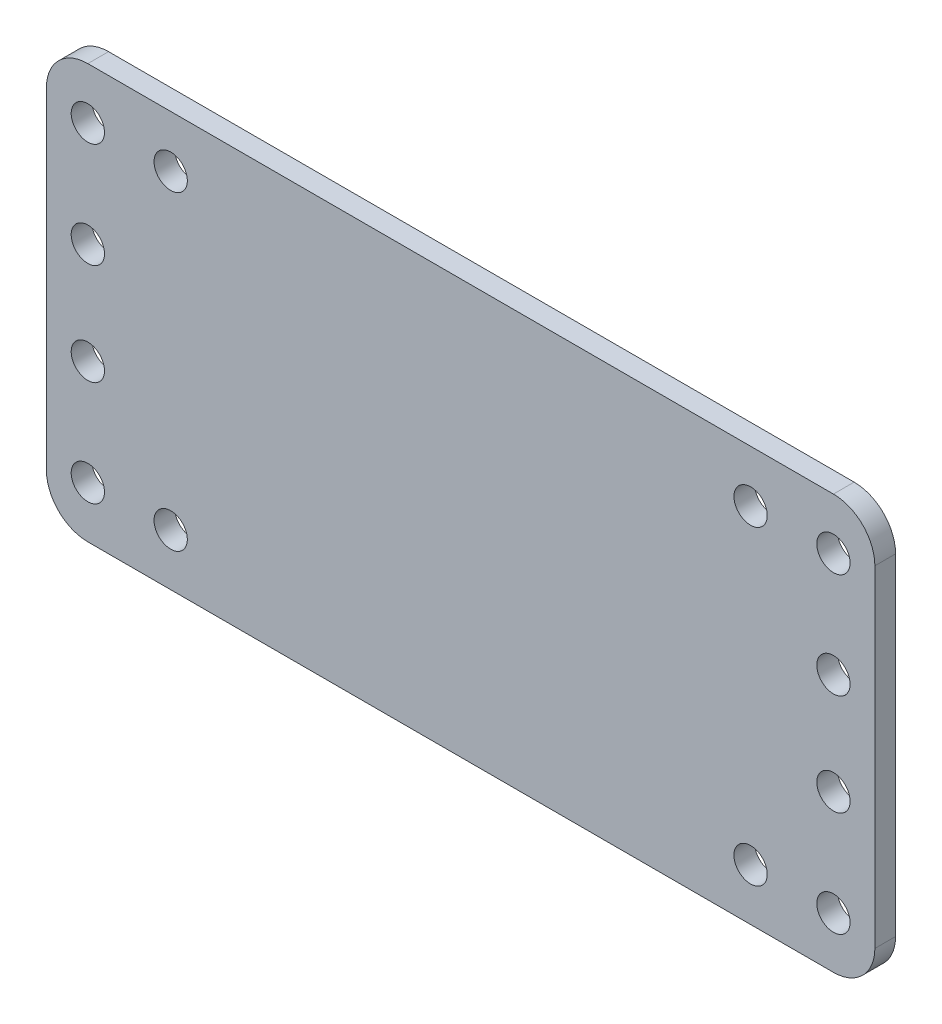
ISO-10303-21;
HEADER;
FILE_DESCRIPTION(('STEP AP214'),'2;1');
FILE_NAME('part.step','',(''),(''),'','','');
FILE_SCHEMA(('AUTOMOTIVE_DESIGN { 1 0 10303 214 1 1 1 1 }'));
ENDSEC;
DATA;
#1=APPLICATION_CONTEXT('core data for automotive mechanical design processes');
#2=APPLICATION_PROTOCOL_DEFINITION('international standard','automotive_design',2000,#1);
#3=PRODUCT_CONTEXT('',#1,'mechanical');
#4=PRODUCT('Part','Part','',(#3));
#5=PRODUCT_RELATED_PRODUCT_CATEGORY('part','',(#4));
#6=PRODUCT_DEFINITION_FORMATION('','',#4);
#7=PRODUCT_DEFINITION_CONTEXT('part definition',#1,'design');
#8=PRODUCT_DEFINITION('design','',#6,#7);
#9=PRODUCT_DEFINITION_SHAPE('','',#8);
#10=(LENGTH_UNIT() NAMED_UNIT(*) SI_UNIT(.MILLI.,.METRE.));
#11=(NAMED_UNIT(*) PLANE_ANGLE_UNIT() SI_UNIT($,.RADIAN.));
#12=(NAMED_UNIT(*) SI_UNIT($,.STERADIAN.) SOLID_ANGLE_UNIT());
#13=UNCERTAINTY_MEASURE_WITH_UNIT(LENGTH_MEASURE(1.E-05),#10,'distance_accuracy_value','');
#14=(GEOMETRIC_REPRESENTATION_CONTEXT(3) GLOBAL_UNCERTAINTY_ASSIGNED_CONTEXT((#13)) GLOBAL_UNIT_ASSIGNED_CONTEXT((#10,
#11,#12)) REPRESENTATION_CONTEXT('',''));
#15=CARTESIAN_POINT('',(0.,0.,0.));
#16=DIRECTION('',(0.,0.,1.));
#17=DIRECTION('',(1.,0.,0.));
#18=AXIS2_PLACEMENT_3D('',#15,#16,#17);
#19=CARTESIAN_POINT('',(0.,0.,-1.5875));
#20=DIRECTION('',(0.,0.,-1.));
#21=DIRECTION('',(-1.,0.,0.));
#22=AXIS2_PLACEMENT_3D('',#19,#20,#21);
#23=PLANE('',#22);
#24=DIRECTION('',(0.,1.,0.));
#25=VECTOR('',#24,1.);
#26=CARTESIAN_POINT('',(-63.5,-31.75,-1.5875));
#27=LINE('',#26,#25);
#28=CARTESIAN_POINT('',(-63.5,-25.4,-1.5875));
#29=VERTEX_POINT('',#28);
#30=CARTESIAN_POINT('',(-63.5,25.4,-1.5875));
#31=VERTEX_POINT('',#30);
#32=EDGE_CURVE('E78',#29,#31,#27,.T.);
#33=ORIENTED_EDGE('',*,*,#32,.T.);
#34=CARTESIAN_POINT('',(-57.15,25.4,-1.5875));
#35=DIRECTION('',(0.,0.,-1.));
#36=DIRECTION('',(-1.,0.,0.));
#37=AXIS2_PLACEMENT_3D('',#34,#35,#36);
#38=CIRCLE('',#37,6.35);
#39=CARTESIAN_POINT('',(-57.15,31.75,-1.5875));
#40=VERTEX_POINT('',#39);
#41=EDGE_CURVE('E169',#40,#31,#38,.F.);
#42=ORIENTED_EDGE('',*,*,#41,.F.);
#43=DIRECTION('',(1.,0.,0.));
#44=VECTOR('',#43,1.);
#45=CARTESIAN_POINT('',(-63.5,31.75,-1.5875));
#46=LINE('',#45,#44);
#47=CARTESIAN_POINT('',(57.15,31.75,-1.5875));
#48=VERTEX_POINT('',#47);
#49=EDGE_CURVE('E114',#40,#48,#46,.T.);
#50=ORIENTED_EDGE('',*,*,#49,.T.);
#51=CARTESIAN_POINT('',(57.15,25.4,-1.5875));
#52=DIRECTION('',(0.,0.,-1.));
#53=DIRECTION('',(-1.,0.,0.));
#54=AXIS2_PLACEMENT_3D('',#51,#52,#53);
#55=CIRCLE('',#54,6.35);
#56=CARTESIAN_POINT('',(63.5,25.4,-1.5875));
#57=VERTEX_POINT('',#56);
#58=EDGE_CURVE('E116',#57,#48,#55,.F.);
#59=ORIENTED_EDGE('',*,*,#58,.F.);
#60=DIRECTION('',(0.,1.,0.));
#61=VECTOR('',#60,1.);
#62=CARTESIAN_POINT('',(63.5,-31.75,-1.5875));
#63=LINE('',#62,#61);
#64=CARTESIAN_POINT('',(63.4999999999999,-25.4,-1.5875));
#65=VERTEX_POINT('',#64);
#66=EDGE_CURVE('E111',#57,#65,#63,.F.);
#67=ORIENTED_EDGE('',*,*,#66,.T.);
#68=CARTESIAN_POINT('',(57.1499999999999,-25.4,-1.5875));
#69=DIRECTION('',(0.,0.,-1.));
#70=DIRECTION('',(-1.,0.,0.));
#71=AXIS2_PLACEMENT_3D('',#68,#69,#70);
#72=CIRCLE('',#71,6.35);
#73=CARTESIAN_POINT('',(57.15,-31.75,-1.5875));
#74=VERTEX_POINT('',#73);
#75=EDGE_CURVE('E97',#74,#65,#72,.F.);
#76=ORIENTED_EDGE('',*,*,#75,.F.);
#77=DIRECTION('',(1.,0.,0.));
#78=VECTOR('',#77,1.);
#79=CARTESIAN_POINT('',(-63.5,-31.75,-1.5875));
#80=LINE('',#79,#78);
#81=CARTESIAN_POINT('',(-57.15,-31.75,-1.5875));
#82=VERTEX_POINT('',#81);
#83=EDGE_CURVE('E92',#74,#82,#80,.F.);
#84=ORIENTED_EDGE('',*,*,#83,.T.);
#85=CARTESIAN_POINT('',(-57.15,-25.4,-1.5875));
#86=DIRECTION('',(0.,0.,-1.));
#87=DIRECTION('',(-1.,0.,0.));
#88=AXIS2_PLACEMENT_3D('',#85,#86,#87);
#89=CIRCLE('',#88,6.35);
#90=EDGE_CURVE('E83',#29,#82,#89,.F.);
#91=ORIENTED_EDGE('',*,*,#90,.F.);
#92=EDGE_LOOP('',(#33,#42,#50,#59,#67,#76,#84,#91));
#93=FACE_BOUND('',#92,.T.);
#94=CARTESIAN_POINT('',(-44.45,23.8125,-1.5875));
#95=DIRECTION('',(0.,0.,1.));
#96=DIRECTION('',(1.,0.,0.));
#97=AXIS2_PLACEMENT_3D('',#94,#95,#96);
#98=CIRCLE('',#97,2.5527);
#99=CARTESIAN_POINT('',(-41.8973,23.8125,-1.5875));
#100=VERTEX_POINT('',#99);
#101=EDGE_CURVE('E101',#100,#100,#98,.T.);
#102=ORIENTED_EDGE('',*,*,#101,.T.);
#103=EDGE_LOOP('',(#102));
#104=FACE_BOUND('',#103,.T.);
#105=CARTESIAN_POINT('',(-57.15,7.76883262356666,-1.5875));
#106=DIRECTION('',(0.,0.,1.));
#107=DIRECTION('',(1.,0.,0.));
#108=AXIS2_PLACEMENT_3D('',#105,#106,#107);
#109=CIRCLE('',#108,2.5527);
#110=CARTESIAN_POINT('',(-54.5973,7.76883262356666,-1.5875));
#111=VERTEX_POINT('',#110);
#112=EDGE_CURVE('E174',#111,#111,#109,.T.);
#113=ORIENTED_EDGE('',*,*,#112,.T.);
#114=EDGE_LOOP('',(#113));
#115=FACE_BOUND('',#114,.T.);
#116=CARTESIAN_POINT('',(-57.15,-7.76883262356668,-1.5875));
#117=DIRECTION('',(0.,0.,1.));
#118=DIRECTION('',(1.,0.,0.));
#119=AXIS2_PLACEMENT_3D('',#116,#117,#118);
#120=CIRCLE('',#119,2.5527);
#121=CARTESIAN_POINT('',(-54.5973,-7.76883262356668,-1.5875));
#122=VERTEX_POINT('',#121);
#123=EDGE_CURVE('E177',#122,#122,#120,.T.);
#124=ORIENTED_EDGE('',*,*,#123,.T.);
#125=EDGE_LOOP('',(#124));
#126=FACE_BOUND('',#125,.T.);
#127=CARTESIAN_POINT('',(-57.15,-23.8727552516291,-1.5875));
#128=DIRECTION('',(0.,0.,1.));
#129=DIRECTION('',(1.,0.,0.));
#130=AXIS2_PLACEMENT_3D('',#127,#128,#129);
#131=CIRCLE('',#130,2.5527);
#132=CARTESIAN_POINT('',(-54.5973,-23.8727552516291,-1.5875));
#133=VERTEX_POINT('',#132);
#134=EDGE_CURVE('E180',#133,#133,#131,.T.);
#135=ORIENTED_EDGE('',*,*,#134,.T.);
#136=EDGE_LOOP('',(#135));
#137=FACE_BOUND('',#136,.T.);
#138=CARTESIAN_POINT('',(-44.45,-23.8125,-1.5875));
#139=DIRECTION('',(0.,0.,1.));
#140=DIRECTION('',(1.,0.,0.));
#141=AXIS2_PLACEMENT_3D('',#138,#139,#140);
#142=CIRCLE('',#141,2.5527);
#143=CARTESIAN_POINT('',(-41.8973,-23.8125,-1.5875));
#144=VERTEX_POINT('',#143);
#145=EDGE_CURVE('E183',#144,#144,#142,.T.);
#146=ORIENTED_EDGE('',*,*,#145,.T.);
#147=EDGE_LOOP('',(#146));
#148=FACE_BOUND('',#147,.T.);
#149=CARTESIAN_POINT('',(44.45,-23.8125,-1.5875));
#150=DIRECTION('',(0.,0.,1.));
#151=DIRECTION('',(1.,0.,0.));
#152=AXIS2_PLACEMENT_3D('',#149,#150,#151);
#153=CIRCLE('',#152,2.5527);
#154=CARTESIAN_POINT('',(47.0027,-23.8125,-1.5875));
#155=VERTEX_POINT('',#154);
#156=EDGE_CURVE('E186',#155,#155,#153,.T.);
#157=ORIENTED_EDGE('',*,*,#156,.T.);
#158=EDGE_LOOP('',(#157));
#159=FACE_BOUND('',#158,.T.);
#160=CARTESIAN_POINT('',(57.15,-23.8727552516291,-1.5875));
#161=DIRECTION('',(0.,0.,1.));
#162=DIRECTION('',(1.,0.,0.));
#163=AXIS2_PLACEMENT_3D('',#160,#161,#162);
#164=CIRCLE('',#163,2.5527);
#165=CARTESIAN_POINT('',(59.7027,-23.8727552516291,-1.5875));
#166=VERTEX_POINT('',#165);
#167=EDGE_CURVE('E189',#166,#166,#164,.T.);
#168=ORIENTED_EDGE('',*,*,#167,.T.);
#169=EDGE_LOOP('',(#168));
#170=FACE_BOUND('',#169,.T.);
#171=CARTESIAN_POINT('',(57.15,-7.76883262356667,-1.5875));
#172=DIRECTION('',(0.,0.,1.));
#173=DIRECTION('',(1.,0.,0.));
#174=AXIS2_PLACEMENT_3D('',#171,#172,#173);
#175=CIRCLE('',#174,2.5527);
#176=CARTESIAN_POINT('',(59.7027,-7.76883262356667,-1.5875));
#177=VERTEX_POINT('',#176);
#178=EDGE_CURVE('E192',#177,#177,#175,.T.);
#179=ORIENTED_EDGE('',*,*,#178,.T.);
#180=EDGE_LOOP('',(#179));
#181=FACE_BOUND('',#180,.T.);
#182=CARTESIAN_POINT('',(57.15,7.76883262356667,-1.5875));
#183=DIRECTION('',(0.,0.,1.));
#184=DIRECTION('',(1.,0.,0.));
#185=AXIS2_PLACEMENT_3D('',#182,#183,#184);
#186=CIRCLE('',#185,2.5527);
#187=CARTESIAN_POINT('',(59.7027,7.76883262356667,-1.5875));
#188=VERTEX_POINT('',#187);
#189=EDGE_CURVE('E195',#188,#188,#186,.T.);
#190=ORIENTED_EDGE('',*,*,#189,.T.);
#191=EDGE_LOOP('',(#190));
#192=FACE_BOUND('',#191,.T.);
#193=CARTESIAN_POINT('',(57.15,23.8727552516291,-1.5875));
#194=DIRECTION('',(0.,0.,1.));
#195=DIRECTION('',(1.,0.,0.));
#196=AXIS2_PLACEMENT_3D('',#193,#194,#195);
#197=CIRCLE('',#196,2.5527);
#198=CARTESIAN_POINT('',(59.7027,23.8727552516291,-1.5875));
#199=VERTEX_POINT('',#198);
#200=EDGE_CURVE('E198',#199,#199,#197,.T.);
#201=ORIENTED_EDGE('',*,*,#200,.T.);
#202=EDGE_LOOP('',(#201));
#203=FACE_BOUND('',#202,.T.);
#204=CARTESIAN_POINT('',(44.45,23.8125,-1.5875));
#205=DIRECTION('',(0.,0.,1.));
#206=DIRECTION('',(1.,0.,0.));
#207=AXIS2_PLACEMENT_3D('',#204,#205,#206);
#208=CIRCLE('',#207,2.5527);
#209=CARTESIAN_POINT('',(47.0027,23.8125,-1.5875));
#210=VERTEX_POINT('',#209);
#211=EDGE_CURVE('E200',#210,#210,#208,.T.);
#212=ORIENTED_EDGE('',*,*,#211,.T.);
#213=EDGE_LOOP('',(#212));
#214=FACE_BOUND('',#213,.T.);
#215=CARTESIAN_POINT('',(-57.15,23.8727552516291,-1.5875));
#216=DIRECTION('',(0.,0.,1.));
#217=DIRECTION('',(1.,0.,0.));
#218=AXIS2_PLACEMENT_3D('',#215,#216,#217);
#219=CIRCLE('',#218,2.5527);
#220=CARTESIAN_POINT('',(-54.5973,23.8727552516291,-1.5875));
#221=VERTEX_POINT('',#220);
#222=EDGE_CURVE('E20',#221,#221,#219,.T.);
#223=ORIENTED_EDGE('',*,*,#222,.T.);
#224=EDGE_LOOP('',(#223));
#225=FACE_BOUND('',#224,.T.);
#226=ADVANCED_FACE('F17',(#93,#104,#115,#126,#137,#148,#159,#170,#181,#192,#203,#214,#225),#23,.T.);
#227=CARTESIAN_POINT('',(-57.15,23.8727552516291,-1.5875));
#228=DIRECTION('',(0.,0.,1.));
#229=DIRECTION('',(1.,0.,0.));
#230=AXIS2_PLACEMENT_3D('',#227,#228,#229);
#231=CYLINDRICAL_SURFACE('',#230,2.5527);
#232=ORIENTED_EDGE('',*,*,#222,.F.);
#233=EDGE_LOOP('',(#232));
#234=FACE_BOUND('',#233,.T.);
#235=CARTESIAN_POINT('',(-57.15,23.8727552516291,1.5875));
#236=DIRECTION('',(0.,0.,1.));
#237=DIRECTION('',(1.,0.,0.));
#238=AXIS2_PLACEMENT_3D('',#235,#236,#237);
#239=CIRCLE('',#238,2.5527);
#240=CARTESIAN_POINT('',(-54.5973,23.8727552516291,1.5875));
#241=VERTEX_POINT('',#240);
#242=EDGE_CURVE('E162',#241,#241,#239,.T.);
#243=ORIENTED_EDGE('',*,*,#242,.T.);
#244=EDGE_LOOP('',(#243));
#245=FACE_BOUND('',#244,.T.);
#246=ADVANCED_FACE('F208',(#234,#245),#231,.F.);
#247=CARTESIAN_POINT('',(44.45,23.8125,-1.5875));
#248=DIRECTION('',(0.,0.,1.));
#249=DIRECTION('',(1.,0.,0.));
#250=AXIS2_PLACEMENT_3D('',#247,#248,#249);
#251=CYLINDRICAL_SURFACE('',#250,2.5527);
#252=ORIENTED_EDGE('',*,*,#211,.F.);
#253=EDGE_LOOP('',(#252));
#254=FACE_BOUND('',#253,.T.);
#255=CARTESIAN_POINT('',(44.45,23.8125,1.5875));
#256=DIRECTION('',(0.,0.,1.));
#257=DIRECTION('',(1.,0.,0.));
#258=AXIS2_PLACEMENT_3D('',#255,#256,#257);
#259=CIRCLE('',#258,2.5527);
#260=CARTESIAN_POINT('',(47.0027,23.8125,1.5875));
#261=VERTEX_POINT('',#260);
#262=EDGE_CURVE('E159',#261,#261,#259,.T.);
#263=ORIENTED_EDGE('',*,*,#262,.T.);
#264=EDGE_LOOP('',(#263));
#265=FACE_BOUND('',#264,.T.);
#266=ADVANCED_FACE('F211',(#254,#265),#251,.F.);
#267=CARTESIAN_POINT('',(57.15,23.8727552516291,-1.5875));
#268=DIRECTION('',(0.,0.,1.));
#269=DIRECTION('',(1.,0.,0.));
#270=AXIS2_PLACEMENT_3D('',#267,#268,#269);
#271=CYLINDRICAL_SURFACE('',#270,2.5527);
#272=ORIENTED_EDGE('',*,*,#200,.F.);
#273=EDGE_LOOP('',(#272));
#274=FACE_BOUND('',#273,.T.);
#275=CARTESIAN_POINT('',(57.15,23.8727552516291,1.5875));
#276=DIRECTION('',(0.,0.,1.));
#277=DIRECTION('',(1.,0.,0.));
#278=AXIS2_PLACEMENT_3D('',#275,#276,#277);
#279=CIRCLE('',#278,2.5527);
#280=CARTESIAN_POINT('',(59.7027,23.8727552516291,1.5875));
#281=VERTEX_POINT('',#280);
#282=EDGE_CURVE('E156',#281,#281,#279,.T.);
#283=ORIENTED_EDGE('',*,*,#282,.T.);
#284=EDGE_LOOP('',(#283));
#285=FACE_BOUND('',#284,.T.);
#286=ADVANCED_FACE('F285',(#274,#285),#271,.F.);
#287=CARTESIAN_POINT('',(57.15,7.76883262356667,-1.5875));
#288=DIRECTION('',(0.,0.,1.));
#289=DIRECTION('',(1.,0.,0.));
#290=AXIS2_PLACEMENT_3D('',#287,#288,#289);
#291=CYLINDRICAL_SURFACE('',#290,2.5527);
#292=ORIENTED_EDGE('',*,*,#189,.F.);
#293=EDGE_LOOP('',(#292));
#294=FACE_BOUND('',#293,.T.);
#295=CARTESIAN_POINT('',(57.15,7.76883262356667,1.5875));
#296=DIRECTION('',(0.,0.,1.));
#297=DIRECTION('',(1.,0.,0.));
#298=AXIS2_PLACEMENT_3D('',#295,#296,#297);
#299=CIRCLE('',#298,2.5527);
#300=CARTESIAN_POINT('',(59.7027,7.76883262356667,1.5875));
#301=VERTEX_POINT('',#300);
#302=EDGE_CURVE('E153',#301,#301,#299,.T.);
#303=ORIENTED_EDGE('',*,*,#302,.T.);
#304=EDGE_LOOP('',(#303));
#305=FACE_BOUND('',#304,.T.);
#306=ADVANCED_FACE('F281',(#294,#305),#291,.F.);
#307=CARTESIAN_POINT('',(57.15,-7.76883262356667,-1.5875));
#308=DIRECTION('',(0.,0.,1.));
#309=DIRECTION('',(1.,0.,0.));
#310=AXIS2_PLACEMENT_3D('',#307,#308,#309);
#311=CYLINDRICAL_SURFACE('',#310,2.5527);
#312=ORIENTED_EDGE('',*,*,#178,.F.);
#313=EDGE_LOOP('',(#312));
#314=FACE_BOUND('',#313,.T.);
#315=CARTESIAN_POINT('',(57.15,-7.76883262356667,1.5875));
#316=DIRECTION('',(0.,0.,1.));
#317=DIRECTION('',(1.,0.,0.));
#318=AXIS2_PLACEMENT_3D('',#315,#316,#317);
#319=CIRCLE('',#318,2.5527);
#320=CARTESIAN_POINT('',(59.7027,-7.76883262356667,1.5875));
#321=VERTEX_POINT('',#320);
#322=EDGE_CURVE('E150',#321,#321,#319,.T.);
#323=ORIENTED_EDGE('',*,*,#322,.T.);
#324=EDGE_LOOP('',(#323));
#325=FACE_BOUND('',#324,.T.);
#326=ADVANCED_FACE('F277',(#314,#325),#311,.F.);
#327=CARTESIAN_POINT('',(57.15,-23.8727552516291,-1.5875));
#328=DIRECTION('',(0.,0.,1.));
#329=DIRECTION('',(1.,0.,0.));
#330=AXIS2_PLACEMENT_3D('',#327,#328,#329);
#331=CYLINDRICAL_SURFACE('',#330,2.5527);
#332=ORIENTED_EDGE('',*,*,#167,.F.);
#333=EDGE_LOOP('',(#332));
#334=FACE_BOUND('',#333,.T.);
#335=CARTESIAN_POINT('',(57.15,-23.8727552516291,1.5875));
#336=DIRECTION('',(0.,0.,1.));
#337=DIRECTION('',(1.,0.,0.));
#338=AXIS2_PLACEMENT_3D('',#335,#336,#337);
#339=CIRCLE('',#338,2.5527);
#340=CARTESIAN_POINT('',(59.7027,-23.8727552516291,1.5875));
#341=VERTEX_POINT('',#340);
#342=EDGE_CURVE('E147',#341,#341,#339,.T.);
#343=ORIENTED_EDGE('',*,*,#342,.T.);
#344=EDGE_LOOP('',(#343));
#345=FACE_BOUND('',#344,.T.);
#346=ADVANCED_FACE('F273',(#334,#345),#331,.F.);
#347=CARTESIAN_POINT('',(44.45,-23.8125,-1.5875));
#348=DIRECTION('',(0.,0.,1.));
#349=DIRECTION('',(1.,0.,0.));
#350=AXIS2_PLACEMENT_3D('',#347,#348,#349);
#351=CYLINDRICAL_SURFACE('',#350,2.5527);
#352=ORIENTED_EDGE('',*,*,#156,.F.);
#353=EDGE_LOOP('',(#352));
#354=FACE_BOUND('',#353,.T.);
#355=CARTESIAN_POINT('',(44.45,-23.8125,1.5875));
#356=DIRECTION('',(0.,0.,1.));
#357=DIRECTION('',(1.,0.,0.));
#358=AXIS2_PLACEMENT_3D('',#355,#356,#357);
#359=CIRCLE('',#358,2.5527);
#360=CARTESIAN_POINT('',(47.0027,-23.8125,1.5875));
#361=VERTEX_POINT('',#360);
#362=EDGE_CURVE('E144',#361,#361,#359,.T.);
#363=ORIENTED_EDGE('',*,*,#362,.T.);
#364=EDGE_LOOP('',(#363));
#365=FACE_BOUND('',#364,.T.);
#366=ADVANCED_FACE('F269',(#354,#365),#351,.F.);
#367=CARTESIAN_POINT('',(-44.45,-23.8125,-1.5875));
#368=DIRECTION('',(0.,0.,1.));
#369=DIRECTION('',(1.,0.,0.));
#370=AXIS2_PLACEMENT_3D('',#367,#368,#369);
#371=CYLINDRICAL_SURFACE('',#370,2.5527);
#372=ORIENTED_EDGE('',*,*,#145,.F.);
#373=EDGE_LOOP('',(#372));
#374=FACE_BOUND('',#373,.T.);
#375=CARTESIAN_POINT('',(-44.45,-23.8125,1.5875));
#376=DIRECTION('',(0.,0.,1.));
#377=DIRECTION('',(1.,0.,0.));
#378=AXIS2_PLACEMENT_3D('',#375,#376,#377);
#379=CIRCLE('',#378,2.5527);
#380=CARTESIAN_POINT('',(-41.8973,-23.8125,1.5875));
#381=VERTEX_POINT('',#380);
#382=EDGE_CURVE('E141',#381,#381,#379,.T.);
#383=ORIENTED_EDGE('',*,*,#382,.T.);
#384=EDGE_LOOP('',(#383));
#385=FACE_BOUND('',#384,.T.);
#386=ADVANCED_FACE('F265',(#374,#385),#371,.F.);
#387=CARTESIAN_POINT('',(-57.15,-23.8727552516291,-1.5875));
#388=DIRECTION('',(0.,0.,1.));
#389=DIRECTION('',(1.,0.,0.));
#390=AXIS2_PLACEMENT_3D('',#387,#388,#389);
#391=CYLINDRICAL_SURFACE('',#390,2.5527);
#392=ORIENTED_EDGE('',*,*,#134,.F.);
#393=EDGE_LOOP('',(#392));
#394=FACE_BOUND('',#393,.T.);
#395=CARTESIAN_POINT('',(-57.15,-23.8727552516291,1.5875));
#396=DIRECTION('',(0.,0.,1.));
#397=DIRECTION('',(1.,0.,0.));
#398=AXIS2_PLACEMENT_3D('',#395,#396,#397);
#399=CIRCLE('',#398,2.5527);
#400=CARTESIAN_POINT('',(-54.5973,-23.8727552516291,1.5875));
#401=VERTEX_POINT('',#400);
#402=EDGE_CURVE('E138',#401,#401,#399,.T.);
#403=ORIENTED_EDGE('',*,*,#402,.T.);
#404=EDGE_LOOP('',(#403));
#405=FACE_BOUND('',#404,.T.);
#406=ADVANCED_FACE('F261',(#394,#405),#391,.F.);
#407=CARTESIAN_POINT('',(-57.15,-7.76883262356668,-1.5875));
#408=DIRECTION('',(0.,0.,1.));
#409=DIRECTION('',(1.,0.,0.));
#410=AXIS2_PLACEMENT_3D('',#407,#408,#409);
#411=CYLINDRICAL_SURFACE('',#410,2.5527);
#412=ORIENTED_EDGE('',*,*,#123,.F.);
#413=EDGE_LOOP('',(#412));
#414=FACE_BOUND('',#413,.T.);
#415=CARTESIAN_POINT('',(-57.15,-7.76883262356668,1.5875));
#416=DIRECTION('',(0.,0.,1.));
#417=DIRECTION('',(1.,0.,0.));
#418=AXIS2_PLACEMENT_3D('',#415,#416,#417);
#419=CIRCLE('',#418,2.5527);
#420=CARTESIAN_POINT('',(-54.5973,-7.76883262356668,1.5875));
#421=VERTEX_POINT('',#420);
#422=EDGE_CURVE('E135',#421,#421,#419,.T.);
#423=ORIENTED_EDGE('',*,*,#422,.T.);
#424=EDGE_LOOP('',(#423));
#425=FACE_BOUND('',#424,.T.);
#426=ADVANCED_FACE('F257',(#414,#425),#411,.F.);
#427=CARTESIAN_POINT('',(-57.15,7.76883262356666,-1.5875));
#428=DIRECTION('',(0.,0.,1.));
#429=DIRECTION('',(1.,0.,0.));
#430=AXIS2_PLACEMENT_3D('',#427,#428,#429);
#431=CYLINDRICAL_SURFACE('',#430,2.5527);
#432=ORIENTED_EDGE('',*,*,#112,.F.);
#433=EDGE_LOOP('',(#432));
#434=FACE_BOUND('',#433,.T.);
#435=CARTESIAN_POINT('',(-57.15,7.76883262356666,1.5875));
#436=DIRECTION('',(0.,0.,1.));
#437=DIRECTION('',(1.,0.,0.));
#438=AXIS2_PLACEMENT_3D('',#435,#436,#437);
#439=CIRCLE('',#438,2.5527);
#440=CARTESIAN_POINT('',(-54.5973,7.76883262356666,1.5875));
#441=VERTEX_POINT('',#440);
#442=EDGE_CURVE('E132',#441,#441,#439,.T.);
#443=ORIENTED_EDGE('',*,*,#442,.T.);
#444=EDGE_LOOP('',(#443));
#445=FACE_BOUND('',#444,.T.);
#446=ADVANCED_FACE('F253',(#434,#445),#431,.F.);
#447=CARTESIAN_POINT('',(-44.45,23.8125,-1.5875));
#448=DIRECTION('',(0.,0.,1.));
#449=DIRECTION('',(1.,0.,0.));
#450=AXIS2_PLACEMENT_3D('',#447,#448,#449);
#451=CYLINDRICAL_SURFACE('',#450,2.5527);
#452=ORIENTED_EDGE('',*,*,#101,.F.);
#453=EDGE_LOOP('',(#452));
#454=FACE_BOUND('',#453,.T.);
#455=CARTESIAN_POINT('',(-44.45,23.8125,1.5875));
#456=DIRECTION('',(0.,0.,1.));
#457=DIRECTION('',(1.,0.,0.));
#458=AXIS2_PLACEMENT_3D('',#455,#456,#457);
#459=CIRCLE('',#458,2.5527);
#460=CARTESIAN_POINT('',(-41.8973,23.8125,1.5875));
#461=VERTEX_POINT('',#460);
#462=EDGE_CURVE('E129',#461,#461,#459,.T.);
#463=ORIENTED_EDGE('',*,*,#462,.T.);
#464=EDGE_LOOP('',(#463));
#465=FACE_BOUND('',#464,.T.);
#466=ADVANCED_FACE('F250',(#454,#465),#451,.F.);
#467=CARTESIAN_POINT('',(-63.5,-31.75,1.5875));
#468=DIRECTION('',(0.,1.,0.));
#469=DIRECTION('',(0.,0.,1.));
#470=AXIS2_PLACEMENT_3D('',#467,#468,#469);
#471=PLANE('',#470);
#472=DIRECTION('',(-1.,0.,0.));
#473=VECTOR('',#472,1.);
#474=CARTESIAN_POINT('',(0.,-31.75,1.5875));
#475=LINE('',#474,#473);
#476=CARTESIAN_POINT('',(57.15,-31.75,1.5875));
#477=VERTEX_POINT('',#476);
#478=CARTESIAN_POINT('',(-57.15,-31.75,1.5875));
#479=VERTEX_POINT('',#478);
#480=EDGE_CURVE('E105',#477,#479,#475,.T.);
#481=ORIENTED_EDGE('',*,*,#480,.T.);
#482=DIRECTION('',(0.,0.,-1.));
#483=VECTOR('',#482,1.);
#484=CARTESIAN_POINT('',(-57.15,-31.75,1.5875));
#485=LINE('',#484,#483);
#486=EDGE_CURVE('E88',#82,#479,#485,.F.);
#487=ORIENTED_EDGE('',*,*,#486,.F.);
#488=ORIENTED_EDGE('',*,*,#83,.F.);
#489=DIRECTION('',(0.,0.,-1.));
#490=VECTOR('',#489,1.);
#491=CARTESIAN_POINT('',(57.15,-31.75,1.5875));
#492=LINE('',#491,#490);
#493=EDGE_CURVE('E165',#477,#74,#492,.T.);
#494=ORIENTED_EDGE('',*,*,#493,.F.);
#495=EDGE_LOOP('',(#481,#487,#488,#494));
#496=FACE_BOUND('',#495,.T.);
#497=ADVANCED_FACE('F104',(#496),#471,.F.);
#498=CARTESIAN_POINT('',(-57.15,-25.4,1.5875));
#499=DIRECTION('',(0.,0.,-1.));
#500=DIRECTION('',(-1.,0.,0.));
#501=AXIS2_PLACEMENT_3D('',#498,#499,#500);
#502=CYLINDRICAL_SURFACE('',#501,6.35);
#503=CARTESIAN_POINT('',(-57.15,-25.4,1.5875));
#504=DIRECTION('',(0.,0.,-1.));
#505=DIRECTION('',(-1.,0.,0.));
#506=AXIS2_PLACEMENT_3D('',#503,#504,#505);
#507=CIRCLE('',#506,6.35);
#508=CARTESIAN_POINT('',(-63.5,-25.4,1.5875));
#509=VERTEX_POINT('',#508);
#510=EDGE_CURVE('E127',#479,#509,#507,.T.);
#511=ORIENTED_EDGE('',*,*,#510,.T.);
#512=DIRECTION('',(0.,0.,-1.));
#513=VECTOR('',#512,1.);
#514=CARTESIAN_POINT('',(-63.5,-25.4,1.5875));
#515=LINE('',#514,#513);
#516=EDGE_CURVE('E90',#509,#29,#515,.T.);
#517=ORIENTED_EDGE('',*,*,#516,.T.);
#518=ORIENTED_EDGE('',*,*,#90,.T.);
#519=ORIENTED_EDGE('',*,*,#486,.T.);
#520=EDGE_LOOP('',(#511,#517,#518,#519));
#521=FACE_BOUND('',#520,.T.);
#522=ADVANCED_FACE('F86',(#521),#502,.T.);
#523=CARTESIAN_POINT('',(-63.5,-31.75,1.5875));
#524=DIRECTION('',(1.,0.,0.));
#525=DIRECTION('',(0.,0.,-1.));
#526=AXIS2_PLACEMENT_3D('',#523,#524,#525);
#527=PLANE('',#526);
#528=DIRECTION('',(0.,1.,0.));
#529=VECTOR('',#528,1.);
#530=CARTESIAN_POINT('',(-63.5,0.,1.5875));
#531=LINE('',#530,#529);
#532=CARTESIAN_POINT('',(-63.5,25.4,1.5875));
#533=VERTEX_POINT('',#532);
#534=EDGE_CURVE('E126',#509,#533,#531,.T.);
#535=ORIENTED_EDGE('',*,*,#534,.T.);
#536=DIRECTION('',(0.,0.,-1.));
#537=VECTOR('',#536,1.);
#538=CARTESIAN_POINT('',(-63.5,25.4,1.5875));
#539=LINE('',#538,#537);
#540=EDGE_CURVE('E170',#31,#533,#539,.F.);
#541=ORIENTED_EDGE('',*,*,#540,.F.);
#542=ORIENTED_EDGE('',*,*,#32,.F.);
#543=ORIENTED_EDGE('',*,*,#516,.F.);
#544=EDGE_LOOP('',(#535,#541,#542,#543));
#545=FACE_BOUND('',#544,.T.);
#546=ADVANCED_FACE('F242',(#545),#527,.F.);
#547=CARTESIAN_POINT('',(-57.15,25.4,1.5875));
#548=DIRECTION('',(0.,0.,-1.));
#549=DIRECTION('',(-1.,0.,0.));
#550=AXIS2_PLACEMENT_3D('',#547,#548,#549);
#551=CYLINDRICAL_SURFACE('',#550,6.35);
#552=CARTESIAN_POINT('',(-57.15,25.4,1.5875));
#553=DIRECTION('',(0.,0.,-1.));
#554=DIRECTION('',(-1.,0.,0.));
#555=AXIS2_PLACEMENT_3D('',#552,#553,#554);
#556=CIRCLE('',#555,6.35);
#557=CARTESIAN_POINT('',(-57.15,31.75,1.5875));
#558=VERTEX_POINT('',#557);
#559=EDGE_CURVE('E123',#533,#558,#556,.T.);
#560=ORIENTED_EDGE('',*,*,#559,.T.);
#561=DIRECTION('',(0.,0.,-1.));
#562=VECTOR('',#561,1.);
#563=CARTESIAN_POINT('',(-57.15,31.75,1.5875));
#564=LINE('',#563,#562);
#565=EDGE_CURVE('E117',#558,#40,#564,.T.);
#566=ORIENTED_EDGE('',*,*,#565,.T.);
#567=ORIENTED_EDGE('',*,*,#41,.T.);
#568=ORIENTED_EDGE('',*,*,#540,.T.);
#569=EDGE_LOOP('',(#560,#566,#567,#568));
#570=FACE_BOUND('',#569,.T.);
#571=ADVANCED_FACE('F238',(#570),#551,.T.);
#572=CARTESIAN_POINT('',(-63.5,31.75,1.5875));
#573=DIRECTION('',(0.,-1.,0.));
#574=DIRECTION('',(0.,0.,-1.));
#575=AXIS2_PLACEMENT_3D('',#572,#573,#574);
#576=PLANE('',#575);
#577=ORIENTED_EDGE('',*,*,#49,.F.);
#578=ORIENTED_EDGE('',*,*,#565,.F.);
#579=DIRECTION('',(-1.,0.,0.));
#580=VECTOR('',#579,1.);
#581=CARTESIAN_POINT('',(0.,31.75,1.5875));
#582=LINE('',#581,#580);
#583=CARTESIAN_POINT('',(57.15,31.75,1.5875));
#584=VERTEX_POINT('',#583);
#585=EDGE_CURVE('E122',#558,#584,#582,.F.);
#586=ORIENTED_EDGE('',*,*,#585,.T.);
#587=DIRECTION('',(0.,0.,-1.));
#588=VECTOR('',#587,1.);
#589=CARTESIAN_POINT('',(57.15,31.75,1.5875));
#590=LINE('',#589,#588);
#591=EDGE_CURVE('E168',#48,#584,#590,.F.);
#592=ORIENTED_EDGE('',*,*,#591,.F.);
#593=EDGE_LOOP('',(#577,#578,#586,#592));
#594=FACE_BOUND('',#593,.T.);
#595=ADVANCED_FACE('F234',(#594),#576,.F.);
#596=CARTESIAN_POINT('',(57.15,25.4,1.5875));
#597=DIRECTION('',(0.,0.,-1.));
#598=DIRECTION('',(-1.,0.,0.));
#599=AXIS2_PLACEMENT_3D('',#596,#597,#598);
#600=CYLINDRICAL_SURFACE('',#599,6.35);
#601=CARTESIAN_POINT('',(57.15,25.4,1.5875));
#602=DIRECTION('',(0.,0.,-1.));
#603=DIRECTION('',(-1.,0.,0.));
#604=AXIS2_PLACEMENT_3D('',#601,#602,#603);
#605=CIRCLE('',#604,6.35);
#606=CARTESIAN_POINT('',(63.5,25.4,1.5875));
#607=VERTEX_POINT('',#606);
#608=EDGE_CURVE('E119',#584,#607,#605,.T.);
#609=ORIENTED_EDGE('',*,*,#608,.T.);
#610=DIRECTION('',(0.,0.,1.));
#611=VECTOR('',#610,1.);
#612=CARTESIAN_POINT('',(63.5,25.4,1.5875));
#613=LINE('',#612,#611);
#614=EDGE_CURVE('E113',#607,#57,#613,.F.);
#615=ORIENTED_EDGE('',*,*,#614,.T.);
#616=ORIENTED_EDGE('',*,*,#58,.T.);
#617=ORIENTED_EDGE('',*,*,#591,.T.);
#618=EDGE_LOOP('',(#609,#615,#616,#617));
#619=FACE_BOUND('',#618,.T.);
#620=ADVANCED_FACE('F230',(#619),#600,.T.);
#621=CARTESIAN_POINT('',(63.5,-31.75,1.5875));
#622=DIRECTION('',(-1.,0.,0.));
#623=DIRECTION('',(0.,0.,1.));
#624=AXIS2_PLACEMENT_3D('',#621,#622,#623);
#625=PLANE('',#624);
#626=ORIENTED_EDGE('',*,*,#66,.F.);
#627=ORIENTED_EDGE('',*,*,#614,.F.);
#628=DIRECTION('',(0.,1.,0.));
#629=VECTOR('',#628,1.);
#630=CARTESIAN_POINT('',(63.5,0.,1.5875));
#631=LINE('',#630,#629);
#632=CARTESIAN_POINT('',(63.4999999999999,-25.4,1.5875));
#633=VERTEX_POINT('',#632);
#634=EDGE_CURVE('E26',#607,#633,#631,.F.);
#635=ORIENTED_EDGE('',*,*,#634,.T.);
#636=DIRECTION('',(0.,0.,-1.));
#637=VECTOR('',#636,1.);
#638=CARTESIAN_POINT('',(63.4999999999999,-25.4,1.5875));
#639=LINE('',#638,#637);
#640=EDGE_CURVE('E34',#65,#633,#639,.F.);
#641=ORIENTED_EDGE('',*,*,#640,.F.);
#642=EDGE_LOOP('',(#626,#627,#635,#641));
#643=FACE_BOUND('',#642,.T.);
#644=ADVANCED_FACE('F223',(#643),#625,.F.);
#645=CARTESIAN_POINT('',(57.1499999999999,-25.4,1.5875));
#646=DIRECTION('',(0.,0.,-1.));
#647=DIRECTION('',(-1.,0.,0.));
#648=AXIS2_PLACEMENT_3D('',#645,#646,#647);
#649=CYLINDRICAL_SURFACE('',#648,6.35);
#650=CARTESIAN_POINT('',(57.1499999999999,-25.4,1.5875));
#651=DIRECTION('',(0.,0.,-1.));
#652=DIRECTION('',(-1.,0.,0.));
#653=AXIS2_PLACEMENT_3D('',#650,#651,#652);
#654=CIRCLE('',#653,6.35);
#655=EDGE_CURVE('E11',#633,#477,#654,.T.);
#656=ORIENTED_EDGE('',*,*,#655,.T.);
#657=ORIENTED_EDGE('',*,*,#493,.T.);
#658=ORIENTED_EDGE('',*,*,#75,.T.);
#659=ORIENTED_EDGE('',*,*,#640,.T.);
#660=EDGE_LOOP('',(#656,#657,#658,#659));
#661=FACE_BOUND('',#660,.T.);
#662=ADVANCED_FACE('F216',(#661),#649,.T.);
#663=CARTESIAN_POINT('',(0.,0.,1.5875));
#664=DIRECTION('',(0.,0.,-1.));
#665=DIRECTION('',(-1.,0.,0.));
#666=AXIS2_PLACEMENT_3D('',#663,#664,#665);
#667=PLANE('',#666);
#668=ORIENTED_EDGE('',*,*,#634,.F.);
#669=ORIENTED_EDGE('',*,*,#608,.F.);
#670=ORIENTED_EDGE('',*,*,#585,.F.);
#671=ORIENTED_EDGE('',*,*,#559,.F.);
#672=ORIENTED_EDGE('',*,*,#534,.F.);
#673=ORIENTED_EDGE('',*,*,#510,.F.);
#674=ORIENTED_EDGE('',*,*,#480,.F.);
#675=ORIENTED_EDGE('',*,*,#655,.F.);
#676=EDGE_LOOP('',(#668,#669,#670,#671,#672,#673,#674,#675));
#677=FACE_BOUND('',#676,.T.);
#678=ORIENTED_EDGE('',*,*,#462,.F.);
#679=EDGE_LOOP('',(#678));
#680=FACE_BOUND('',#679,.T.);
#681=ORIENTED_EDGE('',*,*,#442,.F.);
#682=EDGE_LOOP('',(#681));
#683=FACE_BOUND('',#682,.T.);
#684=ORIENTED_EDGE('',*,*,#422,.F.);
#685=EDGE_LOOP('',(#684));
#686=FACE_BOUND('',#685,.T.);
#687=ORIENTED_EDGE('',*,*,#402,.F.);
#688=EDGE_LOOP('',(#687));
#689=FACE_BOUND('',#688,.T.);
#690=ORIENTED_EDGE('',*,*,#382,.F.);
#691=EDGE_LOOP('',(#690));
#692=FACE_BOUND('',#691,.T.);
#693=ORIENTED_EDGE('',*,*,#362,.F.);
#694=EDGE_LOOP('',(#693));
#695=FACE_BOUND('',#694,.T.);
#696=ORIENTED_EDGE('',*,*,#342,.F.);
#697=EDGE_LOOP('',(#696));
#698=FACE_BOUND('',#697,.T.);
#699=ORIENTED_EDGE('',*,*,#322,.F.);
#700=EDGE_LOOP('',(#699));
#701=FACE_BOUND('',#700,.T.);
#702=ORIENTED_EDGE('',*,*,#302,.F.);
#703=EDGE_LOOP('',(#702));
#704=FACE_BOUND('',#703,.T.);
#705=ORIENTED_EDGE('',*,*,#282,.F.);
#706=EDGE_LOOP('',(#705));
#707=FACE_BOUND('',#706,.T.);
#708=ORIENTED_EDGE('',*,*,#262,.F.);
#709=EDGE_LOOP('',(#708));
#710=FACE_BOUND('',#709,.T.);
#711=ORIENTED_EDGE('',*,*,#242,.F.);
#712=EDGE_LOOP('',(#711));
#713=FACE_BOUND('',#712,.T.);
#714=ADVANCED_FACE('F214',(#677,#680,#683,#686,#689,#692,#695,#698,#701,#704,#707,#710,#713),
#667,.F.);
#715=CLOSED_SHELL('',(#226,#246,#266,#286,#306,#326,#346,#366,#386,#406,#426,#446,#466,#497,
#522,#546,#571,#595,#620,#644,#662,#714));
#716=MANIFOLD_SOLID_BREP('B1',#715);
#717=ADVANCED_BREP_SHAPE_REPRESENTATION('',(#18,#716),#14);
#718=SHAPE_DEFINITION_REPRESENTATION(#9,#717);
ENDSEC;
END-ISO-10303-21;
